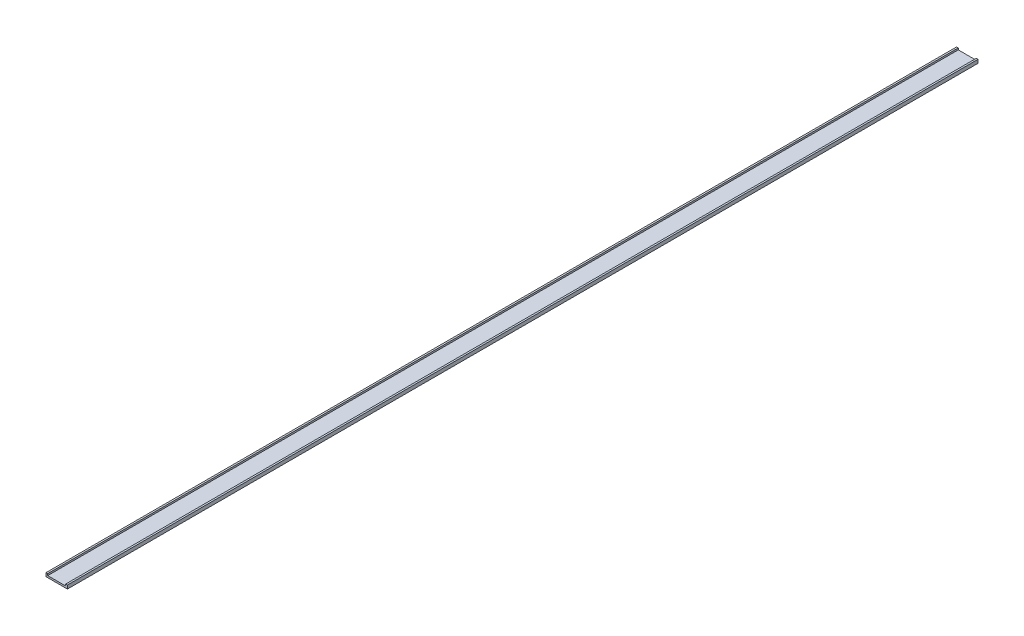
ISO-10303-21;
HEADER;
FILE_DESCRIPTION(('STEP AP214'),'2;1');
FILE_NAME('part.step','',(''),(''),'','','');
FILE_SCHEMA(('AUTOMOTIVE_DESIGN { 1 0 10303 214 1 1 1 1 }'));
ENDSEC;
DATA;
#1=APPLICATION_CONTEXT('core data for automotive mechanical design processes');
#2=APPLICATION_PROTOCOL_DEFINITION('international standard','automotive_design',2000,#1);
#3=PRODUCT_CONTEXT('',#1,'mechanical');
#4=PRODUCT('Part','Part','',(#3));
#5=PRODUCT_RELATED_PRODUCT_CATEGORY('part','',(#4));
#6=PRODUCT_DEFINITION_FORMATION('','',#4);
#7=PRODUCT_DEFINITION_CONTEXT('part definition',#1,'design');
#8=PRODUCT_DEFINITION('design','',#6,#7);
#9=PRODUCT_DEFINITION_SHAPE('','',#8);
#10=(LENGTH_UNIT() NAMED_UNIT(*) SI_UNIT(.MILLI.,.METRE.));
#11=(NAMED_UNIT(*) PLANE_ANGLE_UNIT() SI_UNIT($,.RADIAN.));
#12=(NAMED_UNIT(*) SI_UNIT($,.STERADIAN.) SOLID_ANGLE_UNIT());
#13=UNCERTAINTY_MEASURE_WITH_UNIT(LENGTH_MEASURE(1.E-05),#10,'distance_accuracy_value','');
#14=(GEOMETRIC_REPRESENTATION_CONTEXT(3) GLOBAL_UNCERTAINTY_ASSIGNED_CONTEXT((#13)) GLOBAL_UNIT_ASSIGNED_CONTEXT((#10,
#11,#12)) REPRESENTATION_CONTEXT('',''));
#15=CARTESIAN_POINT('',(0.,0.,0.));
#16=DIRECTION('',(0.,0.,1.));
#17=DIRECTION('',(1.,0.,0.));
#18=AXIS2_PLACEMENT_3D('',#15,#16,#17);
#19=CARTESIAN_POINT('',(-20.,0.,1700.));
#20=DIRECTION('',(1.,0.,0.));
#21=DIRECTION('',(0.,0.,-1.));
#22=AXIS2_PLACEMENT_3D('',#19,#20,#21);
#23=PLANE('',#22);
#24=DIRECTION('',(0.,-1.,0.));
#25=VECTOR('',#24,1.);
#26=CARTESIAN_POINT('',(-20.,0.,0.));
#27=LINE('',#26,#25);
#28=CARTESIAN_POINT('',(-20.,6.59999999999999,0.));
#29=VERTEX_POINT('',#28);
#30=CARTESIAN_POINT('',(-20.,0.,0.));
#31=VERTEX_POINT('',#30);
#32=EDGE_CURVE('E132',#29,#31,#27,.T.);
#33=ORIENTED_EDGE('',*,*,#32,.T.);
#34=DIRECTION('',(0.,0.,-1.));
#35=VECTOR('',#34,1.);
#36=CARTESIAN_POINT('',(-20.,0.,1700.));
#37=LINE('',#36,#35);
#38=CARTESIAN_POINT('',(-20.,0.,1700.));
#39=VERTEX_POINT('',#38);
#40=EDGE_CURVE('E11',#39,#31,#37,.T.);
#41=ORIENTED_EDGE('',*,*,#40,.F.);
#42=DIRECTION('',(0.,-1.,0.));
#43=VECTOR('',#42,1.);
#44=CARTESIAN_POINT('',(-20.,0.,1700.));
#45=LINE('',#44,#43);
#46=CARTESIAN_POINT('',(-20.,6.59999999999999,1700.));
#47=VERTEX_POINT('',#46);
#48=EDGE_CURVE('E146',#47,#39,#45,.T.);
#49=ORIENTED_EDGE('',*,*,#48,.F.);
#50=DIRECTION('',(0.,0.,-1.));
#51=VECTOR('',#50,1.);
#52=CARTESIAN_POINT('',(-20.,6.59999999999999,1700.));
#53=LINE('',#52,#51);
#54=EDGE_CURVE('E128',#47,#29,#53,.T.);
#55=ORIENTED_EDGE('',*,*,#54,.T.);
#56=EDGE_LOOP('',(#33,#41,#49,#55));
#57=FACE_BOUND('',#56,.T.);
#58=ADVANCED_FACE('F36',(#57),#23,.F.);
#59=CARTESIAN_POINT('',(20.,0.,1700.));
#60=DIRECTION('',(0.,1.,0.));
#61=DIRECTION('',(0.,0.,1.));
#62=AXIS2_PLACEMENT_3D('',#59,#60,#61);
#63=PLANE('',#62);
#64=DIRECTION('',(1.,0.,0.));
#65=VECTOR('',#64,1.);
#66=CARTESIAN_POINT('',(20.,0.,0.));
#67=LINE('',#66,#65);
#68=CARTESIAN_POINT('',(20.,0.,0.));
#69=VERTEX_POINT('',#68);
#70=EDGE_CURVE('E135',#31,#69,#67,.T.);
#71=ORIENTED_EDGE('',*,*,#70,.T.);
#72=DIRECTION('',(0.,0.,-1.));
#73=VECTOR('',#72,1.);
#74=CARTESIAN_POINT('',(20.,0.,1700.));
#75=LINE('',#74,#73);
#76=CARTESIAN_POINT('',(20.,0.,1700.));
#77=VERTEX_POINT('',#76);
#78=EDGE_CURVE('E44',#77,#69,#75,.T.);
#79=ORIENTED_EDGE('',*,*,#78,.F.);
#80=DIRECTION('',(1.,0.,0.));
#81=VECTOR('',#80,1.);
#82=CARTESIAN_POINT('',(20.,0.,1700.));
#83=LINE('',#82,#81);
#84=EDGE_CURVE('E95',#39,#77,#83,.T.);
#85=ORIENTED_EDGE('',*,*,#84,.F.);
#86=ORIENTED_EDGE('',*,*,#40,.T.);
#87=EDGE_LOOP('',(#71,#79,#85,#86));
#88=FACE_BOUND('',#87,.T.);
#89=ADVANCED_FACE('F181',(#88),#63,.F.);
#90=CARTESIAN_POINT('',(20.,0.,1700.));
#91=DIRECTION('',(-1.,0.,0.));
#92=DIRECTION('',(0.,0.,1.));
#93=AXIS2_PLACEMENT_3D('',#90,#91,#92);
#94=PLANE('',#93);
#95=DIRECTION('',(0.,1.,0.));
#96=VECTOR('',#95,1.);
#97=CARTESIAN_POINT('',(20.,0.,0.));
#98=LINE('',#97,#96);
#99=CARTESIAN_POINT('',(20.,6.6,0.));
#100=VERTEX_POINT('',#99);
#101=EDGE_CURVE('E137',#69,#100,#98,.T.);
#102=ORIENTED_EDGE('',*,*,#101,.T.);
#103=DIRECTION('',(0.,0.,-1.));
#104=VECTOR('',#103,1.);
#105=CARTESIAN_POINT('',(20.,6.6,1700.));
#106=LINE('',#105,#104);
#107=CARTESIAN_POINT('',(20.,6.6,1700.));
#108=VERTEX_POINT('',#107);
#109=EDGE_CURVE('E153',#108,#100,#106,.T.);
#110=ORIENTED_EDGE('',*,*,#109,.F.);
#111=DIRECTION('',(0.,1.,0.));
#112=VECTOR('',#111,1.);
#113=CARTESIAN_POINT('',(20.,0.,1700.));
#114=LINE('',#113,#112);
#115=EDGE_CURVE('E161',#77,#108,#114,.T.);
#116=ORIENTED_EDGE('',*,*,#115,.F.);
#117=ORIENTED_EDGE('',*,*,#78,.T.);
#118=EDGE_LOOP('',(#102,#110,#116,#117));
#119=FACE_BOUND('',#118,.T.);
#120=ADVANCED_FACE('F159',(#119),#94,.F.);
#121=CARTESIAN_POINT('',(20.,6.6,1700.));
#122=DIRECTION('',(0.,-1.,0.));
#123=DIRECTION('',(1.,0.,0.));
#124=AXIS2_PLACEMENT_3D('',#121,#122,#123);
#125=PLANE('',#124);
#126=DIRECTION('',(-1.,0.,0.));
#127=VECTOR('',#126,1.);
#128=CARTESIAN_POINT('',(20.,6.6,0.));
#129=LINE('',#128,#127);
#130=CARTESIAN_POINT('',(16.8,6.6,0.));
#131=VERTEX_POINT('',#130);
#132=EDGE_CURVE('E139',#100,#131,#129,.T.);
#133=ORIENTED_EDGE('',*,*,#132,.T.);
#134=DIRECTION('',(0.,0.,-1.));
#135=VECTOR('',#134,1.);
#136=CARTESIAN_POINT('',(16.8,6.6,1700.));
#137=LINE('',#136,#135);
#138=CARTESIAN_POINT('',(16.8,6.6,1700.));
#139=VERTEX_POINT('',#138);
#140=EDGE_CURVE('E150',#139,#131,#137,.T.);
#141=ORIENTED_EDGE('',*,*,#140,.F.);
#142=DIRECTION('',(-1.,0.,0.));
#143=VECTOR('',#142,1.);
#144=CARTESIAN_POINT('',(20.,6.6,1700.));
#145=LINE('',#144,#143);
#146=EDGE_CURVE('E173',#108,#139,#145,.T.);
#147=ORIENTED_EDGE('',*,*,#146,.F.);
#148=ORIENTED_EDGE('',*,*,#109,.T.);
#149=EDGE_LOOP('',(#133,#141,#147,#148));
#150=FACE_BOUND('',#149,.T.);
#151=ADVANCED_FACE('F169',(#150),#125,.F.);
#152=CARTESIAN_POINT('',(16.8,6.6,1700.));
#153=DIRECTION('',(1.,0.,0.));
#154=DIRECTION('',(0.,0.,-1.));
#155=AXIS2_PLACEMENT_3D('',#152,#153,#154);
#156=PLANE('',#155);
#157=DIRECTION('',(0.,-1.,0.));
#158=VECTOR('',#157,1.);
#159=CARTESIAN_POINT('',(16.8,6.6,0.));
#160=LINE('',#159,#158);
#161=CARTESIAN_POINT('',(16.8,3.4,0.));
#162=VERTEX_POINT('',#161);
#163=EDGE_CURVE('E141',#131,#162,#160,.T.);
#164=ORIENTED_EDGE('',*,*,#163,.T.);
#165=DIRECTION('',(0.,0.,-1.));
#166=VECTOR('',#165,1.);
#167=CARTESIAN_POINT('',(16.8,3.4,1700.));
#168=LINE('',#167,#166);
#169=CARTESIAN_POINT('',(16.8,3.4,1700.));
#170=VERTEX_POINT('',#169);
#171=EDGE_CURVE('E123',#170,#162,#168,.T.);
#172=ORIENTED_EDGE('',*,*,#171,.F.);
#173=DIRECTION('',(0.,-1.,0.));
#174=VECTOR('',#173,1.);
#175=CARTESIAN_POINT('',(16.8,6.6,1700.));
#176=LINE('',#175,#174);
#177=EDGE_CURVE('E114',#139,#170,#176,.T.);
#178=ORIENTED_EDGE('',*,*,#177,.F.);
#179=ORIENTED_EDGE('',*,*,#140,.T.);
#180=EDGE_LOOP('',(#164,#172,#178,#179));
#181=FACE_BOUND('',#180,.T.);
#182=ADVANCED_FACE('F172',(#181),#156,.F.);
#183=CARTESIAN_POINT('',(-16.8,3.4,1700.));
#184=DIRECTION('',(0.,-1.,0.));
#185=DIRECTION('',(1.,0.,0.));
#186=AXIS2_PLACEMENT_3D('',#183,#184,#185);
#187=PLANE('',#186);
#188=DIRECTION('',(-1.,0.,0.));
#189=VECTOR('',#188,1.);
#190=CARTESIAN_POINT('',(-16.8,3.4,0.));
#191=LINE('',#190,#189);
#192=CARTESIAN_POINT('',(-16.8,3.4,0.));
#193=VERTEX_POINT('',#192);
#194=EDGE_CURVE('E122',#162,#193,#191,.T.);
#195=ORIENTED_EDGE('',*,*,#194,.T.);
#196=DIRECTION('',(0.,0.,-1.));
#197=VECTOR('',#196,1.);
#198=CARTESIAN_POINT('',(-16.8,3.4,1700.));
#199=LINE('',#198,#197);
#200=CARTESIAN_POINT('',(-16.8,3.4,1700.));
#201=VERTEX_POINT('',#200);
#202=EDGE_CURVE('E119',#201,#193,#199,.T.);
#203=ORIENTED_EDGE('',*,*,#202,.F.);
#204=DIRECTION('',(-1.,0.,0.));
#205=VECTOR('',#204,1.);
#206=CARTESIAN_POINT('',(-16.8,3.4,1700.));
#207=LINE('',#206,#205);
#208=EDGE_CURVE('E108',#170,#201,#207,.T.);
#209=ORIENTED_EDGE('',*,*,#208,.F.);
#210=ORIENTED_EDGE('',*,*,#171,.T.);
#211=EDGE_LOOP('',(#195,#203,#209,#210));
#212=FACE_BOUND('',#211,.T.);
#213=ADVANCED_FACE('F120',(#212),#187,.F.);
#214=CARTESIAN_POINT('',(-16.8,6.6,1700.));
#215=DIRECTION('',(-1.,0.,0.));
#216=DIRECTION('',(0.,0.,1.));
#217=AXIS2_PLACEMENT_3D('',#214,#215,#216);
#218=PLANE('',#217);
#219=DIRECTION('',(0.,1.,0.));
#220=VECTOR('',#219,1.);
#221=CARTESIAN_POINT('',(-16.8,6.6,0.));
#222=LINE('',#221,#220);
#223=CARTESIAN_POINT('',(-16.8,6.6,0.));
#224=VERTEX_POINT('',#223);
#225=EDGE_CURVE('E81',#193,#224,#222,.T.);
#226=ORIENTED_EDGE('',*,*,#225,.T.);
#227=DIRECTION('',(0.,0.,-1.));
#228=VECTOR('',#227,1.);
#229=CARTESIAN_POINT('',(-16.8,6.6,1700.));
#230=LINE('',#229,#228);
#231=CARTESIAN_POINT('',(-16.8,6.6,1700.));
#232=VERTEX_POINT('',#231);
#233=EDGE_CURVE('E124',#232,#224,#230,.T.);
#234=ORIENTED_EDGE('',*,*,#233,.F.);
#235=DIRECTION('',(0.,1.,0.));
#236=VECTOR('',#235,1.);
#237=CARTESIAN_POINT('',(-16.8,6.6,1700.));
#238=LINE('',#237,#236);
#239=EDGE_CURVE('E112',#201,#232,#238,.T.);
#240=ORIENTED_EDGE('',*,*,#239,.F.);
#241=ORIENTED_EDGE('',*,*,#202,.T.);
#242=EDGE_LOOP('',(#226,#234,#240,#241));
#243=FACE_BOUND('',#242,.T.);
#244=ADVANCED_FACE('F126',(#243),#218,.F.);
#245=CARTESIAN_POINT('',(-20.,6.59999999999999,1700.));
#246=DIRECTION('',(0.,-1.,0.));
#247=DIRECTION('',(1.,0.,0.));
#248=AXIS2_PLACEMENT_3D('',#245,#246,#247);
#249=PLANE('',#248);
#250=DIRECTION('',(-1.,0.,0.));
#251=VECTOR('',#250,1.);
#252=CARTESIAN_POINT('',(-20.,6.59999999999999,0.));
#253=LINE('',#252,#251);
#254=EDGE_CURVE('E87',#224,#29,#253,.T.);
#255=ORIENTED_EDGE('',*,*,#254,.T.);
#256=ORIENTED_EDGE('',*,*,#54,.F.);
#257=DIRECTION('',(-1.,0.,0.));
#258=VECTOR('',#257,1.);
#259=CARTESIAN_POINT('',(-20.,6.59999999999999,1700.));
#260=LINE('',#259,#258);
#261=EDGE_CURVE('E52',#232,#47,#260,.T.);
#262=ORIENTED_EDGE('',*,*,#261,.F.);
#263=ORIENTED_EDGE('',*,*,#233,.T.);
#264=EDGE_LOOP('',(#255,#256,#262,#263));
#265=FACE_BOUND('',#264,.T.);
#266=ADVANCED_FACE('F197',(#265),#249,.F.);
#267=CARTESIAN_POINT('',(0.,0.,1700.));
#268=DIRECTION('',(0.,0.,-1.));
#269=DIRECTION('',(-1.,0.,0.));
#270=AXIS2_PLACEMENT_3D('',#267,#268,#269);
#271=PLANE('',#270);
#272=ORIENTED_EDGE('',*,*,#48,.T.);
#273=ORIENTED_EDGE('',*,*,#84,.T.);
#274=ORIENTED_EDGE('',*,*,#115,.T.);
#275=ORIENTED_EDGE('',*,*,#146,.T.);
#276=ORIENTED_EDGE('',*,*,#177,.T.);
#277=ORIENTED_EDGE('',*,*,#208,.T.);
#278=ORIENTED_EDGE('',*,*,#239,.T.);
#279=ORIENTED_EDGE('',*,*,#261,.T.);
#280=EDGE_LOOP('',(#272,#273,#274,#275,#276,#277,#278,#279));
#281=FACE_BOUND('',#280,.T.);
#282=ADVANCED_FACE('F110',(#281),#271,.F.);
#283=CARTESIAN_POINT('',(0.,0.,0.));
#284=DIRECTION('',(0.,0.,-1.));
#285=DIRECTION('',(-1.,0.,0.));
#286=AXIS2_PLACEMENT_3D('',#283,#284,#285);
#287=PLANE('',#286);
#288=ORIENTED_EDGE('',*,*,#32,.F.);
#289=ORIENTED_EDGE('',*,*,#254,.F.);
#290=ORIENTED_EDGE('',*,*,#225,.F.);
#291=ORIENTED_EDGE('',*,*,#194,.F.);
#292=ORIENTED_EDGE('',*,*,#163,.F.);
#293=ORIENTED_EDGE('',*,*,#132,.F.);
#294=ORIENTED_EDGE('',*,*,#101,.F.);
#295=ORIENTED_EDGE('',*,*,#70,.F.);
#296=EDGE_LOOP('',(#288,#289,#290,#291,#292,#293,#294,#295));
#297=FACE_BOUND('',#296,.T.);
#298=ADVANCED_FACE('F165',(#297),#287,.T.);
#299=CLOSED_SHELL('',(#58,#89,#120,#151,#182,#213,#244,#266,#282,#298));
#300=MANIFOLD_SOLID_BREP('B2',#299);
#301=ADVANCED_BREP_SHAPE_REPRESENTATION('',(#18,#300),#14);
#302=SHAPE_DEFINITION_REPRESENTATION(#9,#301);
ENDSEC;
END-ISO-10303-21;
